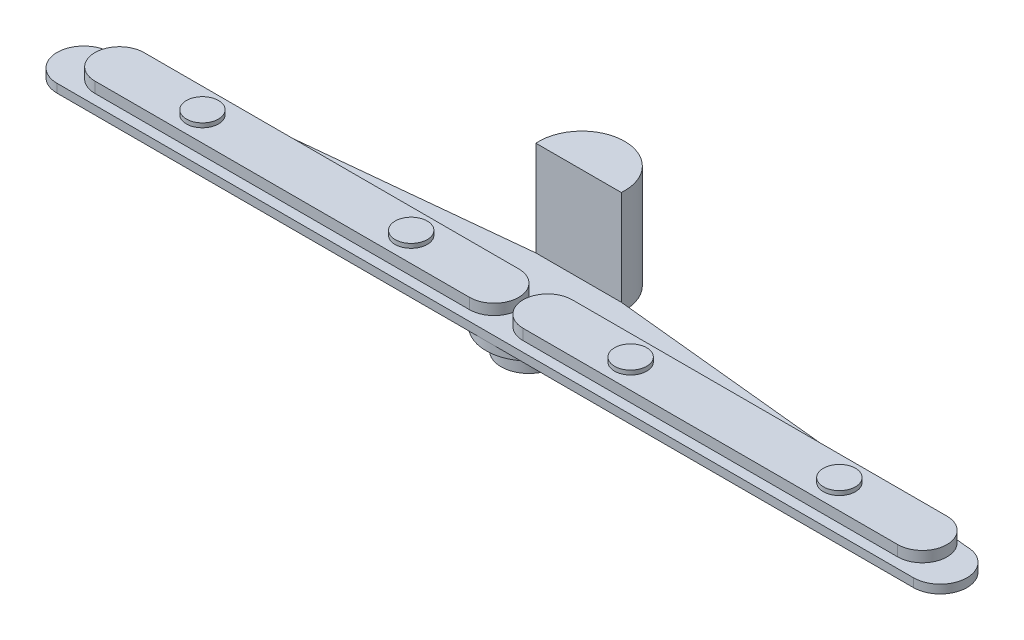
ISO-10303-21;
HEADER;
FILE_DESCRIPTION(('STEP AP214'),'2;1');
FILE_NAME('part.step','',(''),(''),'','','');
FILE_SCHEMA(('AUTOMOTIVE_DESIGN { 1 0 10303 214 1 1 1 1 }'));
ENDSEC;
DATA;
#1=APPLICATION_CONTEXT('core data for automotive mechanical design processes');
#2=APPLICATION_PROTOCOL_DEFINITION('international standard','automotive_design',2000,#1);
#3=PRODUCT_CONTEXT('',#1,'mechanical');
#4=PRODUCT('Part','Part','',(#3));
#5=PRODUCT_RELATED_PRODUCT_CATEGORY('part','',(#4));
#6=PRODUCT_DEFINITION_FORMATION('','',#4);
#7=PRODUCT_DEFINITION_CONTEXT('part definition',#1,'design');
#8=PRODUCT_DEFINITION('design','',#6,#7);
#9=PRODUCT_DEFINITION_SHAPE('','',#8);
#10=(LENGTH_UNIT() NAMED_UNIT(*) SI_UNIT(.MILLI.,.METRE.));
#11=(NAMED_UNIT(*) PLANE_ANGLE_UNIT() SI_UNIT($,.RADIAN.));
#12=(NAMED_UNIT(*) SI_UNIT($,.STERADIAN.) SOLID_ANGLE_UNIT());
#13=UNCERTAINTY_MEASURE_WITH_UNIT(LENGTH_MEASURE(1.E-05),#10,'distance_accuracy_value','');
#14=(GEOMETRIC_REPRESENTATION_CONTEXT(3) GLOBAL_UNCERTAINTY_ASSIGNED_CONTEXT((#13)) GLOBAL_UNIT_ASSIGNED_CONTEXT((#10,
#11,#12)) REPRESENTATION_CONTEXT('',''));
#15=CARTESIAN_POINT('',(0.,0.,0.));
#16=DIRECTION('',(0.,0.,1.));
#17=DIRECTION('',(1.,0.,0.));
#18=AXIS2_PLACEMENT_3D('',#15,#16,#17);
#19=CARTESIAN_POINT('',(-1446.89535492094,40.,407.233116230003));
#20=DIRECTION('',(0.,1.,0.));
#21=DIRECTION('',(0.,0.,1.));
#22=AXIS2_PLACEMENT_3D('',#19,#20,#21);
#23=PLANE('',#22);
#24=DIRECTION('',(-0.994906857184754,0.,-0.100798539308642));
#25=VECTOR('',#24,1.);
#26=CARTESIAN_POINT('',(2553.06053303877,40.,282.233124013492));
#27=LINE('',#26,#25);
#28=CARTESIAN_POINT('',(2281.62856086851,40.,254.733116230003));
#29=VERTEX_POINT('',#28);
#30=CARTESIAN_POINT('',(756.636813568834,40.,100.229265467022));
#31=VERTEX_POINT('',#30);
#32=EDGE_CURVE('E284',#29,#31,#27,.T.);
#33=ORIENTED_EDGE('',*,*,#32,.T.);
#34=DIRECTION('',(1.,0.,0.));
#35=VECTOR('',#34,1.);
#36=CARTESIAN_POINT('',(756.636813568834,40.,100.229265467022));
#37=LINE('',#36,#35);
#38=CARTESIAN_POINT('',(357.756813568834,40.,100.229265467022));
#39=VERTEX_POINT('',#38);
#40=EDGE_CURVE('E171',#39,#31,#37,.T.);
#41=ORIENTED_EDGE('',*,*,#40,.F.);
#42=DIRECTION('',(-0.994891530483461,0.,0.100949703180724));
#43=VECTOR('',#42,1.);
#44=CARTESIAN_POINT('',(-1438.63923170271,40.,282.5060685242));
#45=LINE('',#44,#43);
#46=CARTESIAN_POINT('',(-1164.92792653372,40.,254.733116230003));
#47=VERTEX_POINT('',#46);
#48=EDGE_CURVE('E290',#39,#47,#45,.T.);
#49=ORIENTED_EDGE('',*,*,#48,.T.);
#50=DIRECTION('',(-1.,0.,0.));
#51=VECTOR('',#50,1.);
#52=CARTESIAN_POINT('',(-1317.80318643117,40.,254.733116230003));
#53=LINE('',#52,#51);
#54=CARTESIAN_POINT('',(432.196813568834,40.,254.733116230003));
#55=VERTEX_POINT('',#54);
#56=EDGE_CURVE('E227',#55,#47,#53,.T.);
#57=ORIENTED_EDGE('',*,*,#56,.F.);
#58=CARTESIAN_POINT('',(432.196813568834,40.,369.733116230003));
#59=DIRECTION('',(0.,1.,0.));
#60=DIRECTION('',(0.,0.,1.));
#61=AXIS2_PLACEMENT_3D('',#58,#59,#60);
#62=CIRCLE('',#61,115.);
#63=CARTESIAN_POINT('',(432.196813568834,40.,484.733116230003));
#64=VERTEX_POINT('',#63);
#65=EDGE_CURVE('E210',#64,#55,#62,.T.);
#66=ORIENTED_EDGE('',*,*,#65,.F.);
#67=DIRECTION('',(1.,0.,0.));
#68=VECTOR('',#67,1.);
#69=CARTESIAN_POINT('',(432.196813568834,40.,484.733116230003));
#70=LINE('',#69,#68);
#71=CARTESIAN_POINT('',(-1317.80318643117,40.,484.733116230003));
#72=VERTEX_POINT('',#71);
#73=EDGE_CURVE('E217',#72,#64,#70,.T.);
#74=ORIENTED_EDGE('',*,*,#73,.F.);
#75=CARTESIAN_POINT('',(-1317.80318643117,40.,369.733116230003));
#76=DIRECTION('',(0.,1.,0.));
#77=DIRECTION('',(0.,0.,1.));
#78=AXIS2_PLACEMENT_3D('',#75,#76,#77);
#79=CIRCLE('',#78,115.);
#80=CARTESIAN_POINT('',(-1386.04516728354,40.,277.169451386045));
#81=VERTEX_POINT('',#80);
#82=EDGE_CURVE('E37',#72,#81,#79,.F.);
#83=ORIENTED_EDGE('',*,*,#82,.T.);
#84=CARTESIAN_POINT('',(-1438.63923170271,40.,282.5060685242));
#85=VERTEX_POINT('',#84);
#86=EDGE_CURVE('E288',#81,#85,#45,.T.);
#87=ORIENTED_EDGE('',*,*,#86,.T.);
#88=CARTESIAN_POINT('',(-1446.89535492094,40.,407.233116230003));
#89=DIRECTION('',(0.,1.,0.));
#90=DIRECTION('',(0.,0.,1.));
#91=AXIS2_PLACEMENT_3D('',#88,#89,#90);
#92=CIRCLE('',#91,125.);
#93=CARTESIAN_POINT('',(-1446.89535492094,40.,532.233116230003));
#94=VERTEX_POINT('',#93);
#95=EDGE_CURVE('E276',#85,#94,#92,.T.);
#96=ORIENTED_EDGE('',*,*,#95,.T.);
#97=DIRECTION('',(1.,0.,0.));
#98=VECTOR('',#97,1.);
#99=CARTESIAN_POINT('',(-1446.89535492094,40.,532.233116230003));
#100=LINE('',#99,#98);
#101=CARTESIAN_POINT('',(2553.10464507906,40.,532.233116230002));
#102=VERTEX_POINT('',#101);
#103=EDGE_CURVE('E279',#94,#102,#100,.T.);
#104=ORIENTED_EDGE('',*,*,#103,.T.);
#105=CARTESIAN_POINT('',(2553.10464507906,40.,407.233116230003));
#106=DIRECTION('',(0.,1.,0.));
#107=DIRECTION('',(0.,0.,1.));
#108=AXIS2_PLACEMENT_3D('',#105,#106,#107);
#109=CIRCLE('',#108,125.);
#110=CARTESIAN_POINT('',(2553.06053303877,40.,282.233124013492));
#111=VERTEX_POINT('',#110);
#112=EDGE_CURVE('E282',#102,#111,#109,.T.);
#113=ORIENTED_EDGE('',*,*,#112,.T.);
#114=CARTESIAN_POINT('',(2500.01553383146,40.,276.858893854043));
#115=VERTEX_POINT('',#114);
#116=EDGE_CURVE('E285',#111,#115,#27,.T.);
#117=ORIENTED_EDGE('',*,*,#116,.T.);
#118=CARTESIAN_POINT('',(2432.19681356883,40.,369.733116230003));
#119=DIRECTION('',(0.,1.,0.));
#120=DIRECTION('',(0.,0.,1.));
#121=AXIS2_PLACEMENT_3D('',#118,#119,#120);
#122=CIRCLE('',#121,115.);
#123=CARTESIAN_POINT('',(2432.19681356883,40.,484.733116230003));
#124=VERTEX_POINT('',#123);
#125=EDGE_CURVE('E258',#124,#115,#122,.T.);
#126=ORIENTED_EDGE('',*,*,#125,.F.);
#127=DIRECTION('',(1.,0.,0.));
#128=VECTOR('',#127,1.);
#129=CARTESIAN_POINT('',(682.196813568834,40.,484.733116230003));
#130=LINE('',#129,#128);
#131=CARTESIAN_POINT('',(682.196813568834,40.,484.733116230003));
#132=VERTEX_POINT('',#131);
#133=EDGE_CURVE('E254',#132,#124,#130,.T.);
#134=ORIENTED_EDGE('',*,*,#133,.F.);
#135=CARTESIAN_POINT('',(682.196813568834,40.,369.733116230003));
#136=DIRECTION('',(0.,1.,0.));
#137=DIRECTION('',(0.,0.,1.));
#138=AXIS2_PLACEMENT_3D('',#135,#136,#137);
#139=CIRCLE('',#138,115.);
#140=CARTESIAN_POINT('',(682.196813568834,40.,254.733116230003));
#141=VERTEX_POINT('',#140);
#142=EDGE_CURVE('E57',#141,#132,#139,.T.);
#143=ORIENTED_EDGE('',*,*,#142,.F.);
#144=DIRECTION('',(-1.,0.,0.));
#145=VECTOR('',#144,1.);
#146=CARTESIAN_POINT('',(682.196813568834,40.,254.733116230003));
#147=LINE('',#146,#145);
#148=EDGE_CURVE('E263',#29,#141,#147,.T.);
#149=ORIENTED_EDGE('',*,*,#148,.F.);
#150=EDGE_LOOP('',(#33,#41,#49,#57,#66,#74,#83,#87,#96,#104,#113,#117,#126,#134,#143,#149));
#151=FACE_BOUND('',#150,.T.);
#152=ADVANCED_FACE('F33',(#151),#23,.T.);
#153=CARTESIAN_POINT('',(-1446.89535492094,40.,407.233116230003));
#154=DIRECTION('',(0.,-1.,0.));
#155=DIRECTION('',(0.,0.,-1.));
#156=AXIS2_PLACEMENT_3D('',#153,#154,#155);
#157=CYLINDRICAL_SURFACE('',#156,125.);
#158=CARTESIAN_POINT('',(-1446.89535492094,0.,407.233116230003));
#159=DIRECTION('',(0.,1.,0.));
#160=DIRECTION('',(0.,0.,1.));
#161=AXIS2_PLACEMENT_3D('',#158,#159,#160);
#162=CIRCLE('',#161,125.);
#163=CARTESIAN_POINT('',(-1438.63923170271,0.,282.5060685242));
#164=VERTEX_POINT('',#163);
#165=CARTESIAN_POINT('',(-1446.89535492094,0.,532.233116230003));
#166=VERTEX_POINT('',#165);
#167=EDGE_CURVE('E275',#164,#166,#162,.T.);
#168=ORIENTED_EDGE('',*,*,#167,.T.);
#169=DIRECTION('',(0.,-1.,0.));
#170=VECTOR('',#169,1.);
#171=CARTESIAN_POINT('',(-1446.89535492094,40.,532.233116230003));
#172=LINE('',#171,#170);
#173=EDGE_CURVE('E318',#94,#166,#172,.T.);
#174=ORIENTED_EDGE('',*,*,#173,.F.);
#175=ORIENTED_EDGE('',*,*,#95,.F.);
#176=DIRECTION('',(0.,-1.,0.));
#177=VECTOR('',#176,1.);
#178=CARTESIAN_POINT('',(-1438.63923170271,40.,282.5060685242));
#179=LINE('',#178,#177);
#180=EDGE_CURVE('E293',#85,#164,#179,.T.);
#181=ORIENTED_EDGE('',*,*,#180,.T.);
#182=EDGE_LOOP('',(#168,#174,#175,#181));
#183=FACE_BOUND('',#182,.T.);
#184=ADVANCED_FACE('F35',(#183),#157,.T.);
#185=CARTESIAN_POINT('',(-1446.89535492094,40.,532.233116230003));
#186=DIRECTION('',(0.,0.,-1.));
#187=DIRECTION('',(-1.,0.,0.));
#188=AXIS2_PLACEMENT_3D('',#185,#186,#187);
#189=PLANE('',#188);
#190=DIRECTION('',(1.,0.,0.));
#191=VECTOR('',#190,1.);
#192=CARTESIAN_POINT('',(-1446.89535492094,0.,532.233116230003));
#193=LINE('',#192,#191);
#194=CARTESIAN_POINT('',(557.196813568834,0.,532.233116230002));
#195=VERTEX_POINT('',#194);
#196=EDGE_CURVE('E298',#166,#195,#193,.T.);
#197=ORIENTED_EDGE('',*,*,#196,.T.);
#198=CARTESIAN_POINT('',(2553.10464507906,0.,532.233116230002));
#199=VERTEX_POINT('',#198);
#200=EDGE_CURVE('E297',#195,#199,#193,.T.);
#201=ORIENTED_EDGE('',*,*,#200,.T.);
#202=DIRECTION('',(0.,-1.,0.));
#203=VECTOR('',#202,1.);
#204=CARTESIAN_POINT('',(2553.10464507906,40.,532.233116230002));
#205=LINE('',#204,#203);
#206=EDGE_CURVE('E316',#102,#199,#205,.T.);
#207=ORIENTED_EDGE('',*,*,#206,.F.);
#208=ORIENTED_EDGE('',*,*,#103,.F.);
#209=ORIENTED_EDGE('',*,*,#173,.T.);
#210=EDGE_LOOP('',(#197,#201,#207,#208,#209));
#211=FACE_BOUND('',#210,.T.);
#212=ADVANCED_FACE('F356',(#211),#189,.F.);
#213=CARTESIAN_POINT('',(2553.10464507906,40.,407.233116230003));
#214=DIRECTION('',(0.,-1.,0.));
#215=DIRECTION('',(0.,0.,-1.));
#216=AXIS2_PLACEMENT_3D('',#213,#214,#215);
#217=CYLINDRICAL_SURFACE('',#216,125.);
#218=CARTESIAN_POINT('',(2553.10464507906,0.,407.233116230003));
#219=DIRECTION('',(0.,1.,0.));
#220=DIRECTION('',(0.,0.,1.));
#221=AXIS2_PLACEMENT_3D('',#218,#219,#220);
#222=CIRCLE('',#221,125.);
#223=CARTESIAN_POINT('',(2553.06053303877,0.,282.233124013492));
#224=VERTEX_POINT('',#223);
#225=EDGE_CURVE('E300',#199,#224,#222,.T.);
#226=ORIENTED_EDGE('',*,*,#225,.T.);
#227=DIRECTION('',(0.,-1.,0.));
#228=VECTOR('',#227,1.);
#229=CARTESIAN_POINT('',(2553.06053303877,40.,282.233124013492));
#230=LINE('',#229,#228);
#231=EDGE_CURVE('E313',#111,#224,#230,.T.);
#232=ORIENTED_EDGE('',*,*,#231,.F.);
#233=ORIENTED_EDGE('',*,*,#112,.F.);
#234=ORIENTED_EDGE('',*,*,#206,.T.);
#235=EDGE_LOOP('',(#226,#232,#233,#234));
#236=FACE_BOUND('',#235,.T.);
#237=ADVANCED_FACE('F359',(#236),#217,.T.);
#238=CARTESIAN_POINT('',(2553.06053303877,40.,282.233124013492));
#239=DIRECTION('',(-0.100798539308642,0.,0.994906857184754));
#240=DIRECTION('',(0.994906857184754,0.,0.100798539308642));
#241=AXIS2_PLACEMENT_3D('',#238,#239,#240);
#242=PLANE('',#241);
#243=DIRECTION('',(-0.994906857184754,0.,-0.100798539308642));
#244=VECTOR('',#243,1.);
#245=CARTESIAN_POINT('',(2553.06053303877,0.,282.233124013492));
#246=LINE('',#245,#244);
#247=CARTESIAN_POINT('',(756.636813568834,0.,100.229265467022));
#248=VERTEX_POINT('',#247);
#249=EDGE_CURVE('E302',#224,#248,#246,.T.);
#250=ORIENTED_EDGE('',*,*,#249,.T.);
#251=DIRECTION('',(0.,-1.,0.));
#252=VECTOR('',#251,1.);
#253=CARTESIAN_POINT('',(756.636813568834,40.,100.229265467022));
#254=LINE('',#253,#252);
#255=EDGE_CURVE('E310',#31,#248,#254,.T.);
#256=ORIENTED_EDGE('',*,*,#255,.F.);
#257=ORIENTED_EDGE('',*,*,#32,.F.);
#258=EDGE_CURVE('E289',#115,#29,#27,.T.);
#259=ORIENTED_EDGE('',*,*,#258,.F.);
#260=ORIENTED_EDGE('',*,*,#116,.F.);
#261=ORIENTED_EDGE('',*,*,#231,.T.);
#262=EDGE_LOOP('',(#250,#256,#257,#259,#260,#261));
#263=FACE_BOUND('',#262,.T.);
#264=ADVANCED_FACE('F362',(#263),#242,.F.);
#265=CARTESIAN_POINT('',(557.196813568834,40.,85.2731162300026));
#266=DIRECTION('',(0.,-1.,0.));
#267=DIRECTION('',(0.,0.,-1.));
#268=AXIS2_PLACEMENT_3D('',#265,#266,#267);
#269=CYLINDRICAL_SURFACE('',#268,200.);
#270=CARTESIAN_POINT('',(557.196813568834,0.,85.2731162300026));
#271=DIRECTION('',(0.,1.,0.));
#272=DIRECTION('',(0.,0.,1.));
#273=AXIS2_PLACEMENT_3D('',#270,#271,#272);
#274=CIRCLE('',#273,200.);
#275=CARTESIAN_POINT('',(357.756813568834,0.,100.229265467022));
#276=VERTEX_POINT('',#275);
#277=EDGE_CURVE('E304',#248,#276,#274,.T.);
#278=ORIENTED_EDGE('',*,*,#277,.T.);
#279=DIRECTION('',(0.,-1.,0.));
#280=VECTOR('',#279,1.);
#281=CARTESIAN_POINT('',(357.756813568834,40.,100.229265467022));
#282=LINE('',#281,#280);
#283=EDGE_CURVE('E176',#39,#276,#282,.T.);
#284=ORIENTED_EDGE('',*,*,#283,.F.);
#285=DIRECTION('',(0.,-1.,0.));
#286=VECTOR('',#285,1.);
#287=CARTESIAN_POINT('',(357.756813568834,484.,100.229265467022));
#288=LINE('',#287,#286);
#289=CARTESIAN_POINT('',(357.756813568834,484.,100.229265467022));
#290=VERTEX_POINT('',#289);
#291=EDGE_CURVE('E162',#290,#39,#288,.T.);
#292=ORIENTED_EDGE('',*,*,#291,.F.);
#293=CARTESIAN_POINT('',(557.196813568834,484.,85.2731162300026));
#294=DIRECTION('',(0.,1.,0.));
#295=DIRECTION('',(0.,0.,1.));
#296=AXIS2_PLACEMENT_3D('',#293,#294,#295);
#297=CIRCLE('',#296,200.);
#298=CARTESIAN_POINT('',(756.636813568834,484.,100.229265467022));
#299=VERTEX_POINT('',#298);
#300=EDGE_CURVE('E167',#299,#290,#297,.T.);
#301=ORIENTED_EDGE('',*,*,#300,.F.);
#302=DIRECTION('',(0.,-1.,0.));
#303=VECTOR('',#302,1.);
#304=CARTESIAN_POINT('',(756.636813568834,484.,100.229265467022));
#305=LINE('',#304,#303);
#306=EDGE_CURVE('E164',#299,#31,#305,.T.);
#307=ORIENTED_EDGE('',*,*,#306,.T.);
#308=ORIENTED_EDGE('',*,*,#255,.T.);
#309=EDGE_LOOP('',(#278,#284,#292,#301,#307,#308));
#310=FACE_BOUND('',#309,.T.);
#311=ADVANCED_FACE('F174',(#310),#269,.T.);
#312=CARTESIAN_POINT('',(-1438.63923170271,40.,282.5060685242));
#313=DIRECTION('',(0.100949703180724,0.,0.994891530483461));
#314=DIRECTION('',(0.994891530483461,0.,-0.100949703180724));
#315=AXIS2_PLACEMENT_3D('',#312,#313,#314);
#316=PLANE('',#315);
#317=DIRECTION('',(-0.994891530483461,0.,0.100949703180724));
#318=VECTOR('',#317,1.);
#319=CARTESIAN_POINT('',(-1438.63923170271,0.,282.5060685242));
#320=LINE('',#319,#318);
#321=EDGE_CURVE('E280',#276,#164,#320,.T.);
#322=ORIENTED_EDGE('',*,*,#321,.T.);
#323=ORIENTED_EDGE('',*,*,#180,.F.);
#324=ORIENTED_EDGE('',*,*,#86,.F.);
#325=EDGE_CURVE('E294',#47,#81,#45,.T.);
#326=ORIENTED_EDGE('',*,*,#325,.F.);
#327=ORIENTED_EDGE('',*,*,#48,.F.);
#328=ORIENTED_EDGE('',*,*,#283,.T.);
#329=EDGE_LOOP('',(#322,#323,#324,#326,#327,#328));
#330=FACE_BOUND('',#329,.T.);
#331=ADVANCED_FACE('F332',(#330),#316,.F.);
#332=CARTESIAN_POINT('',(-1446.89535492094,0.,407.233116230003));
#333=DIRECTION('',(0.,1.,0.));
#334=DIRECTION('',(0.,0.,1.));
#335=AXIS2_PLACEMENT_3D('',#332,#333,#334);
#336=PLANE('',#335);
#337=ORIENTED_EDGE('',*,*,#200,.F.);
#338=CARTESIAN_POINT('',(557.196813568834,0.,332.233116230002));
#339=DIRECTION('',(0.,-1.,0.));
#340=DIRECTION('',(0.,0.,-1.));
#341=AXIS2_PLACEMENT_3D('',#338,#339,#340);
#342=CIRCLE('',#341,200.);
#343=EDGE_CURVE('E178',#195,#195,#342,.T.);
#344=ORIENTED_EDGE('',*,*,#343,.F.);
#345=ORIENTED_EDGE('',*,*,#196,.F.);
#346=ORIENTED_EDGE('',*,*,#167,.F.);
#347=ORIENTED_EDGE('',*,*,#321,.F.);
#348=ORIENTED_EDGE('',*,*,#277,.F.);
#349=ORIENTED_EDGE('',*,*,#249,.F.);
#350=ORIENTED_EDGE('',*,*,#225,.F.);
#351=EDGE_LOOP('',(#337,#344,#345,#346,#347,#348,#349,#350));
#352=FACE_BOUND('',#351,.T.);
#353=ADVANCED_FACE('F349',(#352),#336,.F.);
#354=CARTESIAN_POINT('',(682.196813568834,40.,369.733116230003));
#355=DIRECTION('',(0.,1.,0.));
#356=DIRECTION('',(0.,0.,1.));
#357=AXIS2_PLACEMENT_3D('',#354,#355,#356);
#358=PLANE('',#357);
#359=CARTESIAN_POINT('',(2432.19681356883,40.,254.733116230002));
#360=VERTEX_POINT('',#359);
#361=EDGE_CURVE('E257',#115,#360,#122,.T.);
#362=ORIENTED_EDGE('',*,*,#361,.F.);
#363=ORIENTED_EDGE('',*,*,#258,.T.);
#364=EDGE_CURVE('E246',#360,#29,#147,.T.);
#365=ORIENTED_EDGE('',*,*,#364,.F.);
#366=EDGE_LOOP('',(#362,#363,#365));
#367=FACE_BOUND('',#366,.T.);
#368=ADVANCED_FACE('F368',(#367),#358,.F.);
#369=CARTESIAN_POINT('',(682.196813568834,90.,369.733116230003));
#370=DIRECTION('',(0.,-1.,0.));
#371=DIRECTION('',(0.,0.,-1.));
#372=AXIS2_PLACEMENT_3D('',#369,#370,#371);
#373=CYLINDRICAL_SURFACE('',#372,115.);
#374=ORIENTED_EDGE('',*,*,#142,.T.);
#375=DIRECTION('',(0.,-1.,0.));
#376=VECTOR('',#375,1.);
#377=CARTESIAN_POINT('',(682.196813568834,90.,484.733116230003));
#378=LINE('',#377,#376);
#379=CARTESIAN_POINT('',(682.196813568834,90.,484.733116230003));
#380=VERTEX_POINT('',#379);
#381=EDGE_CURVE('E272',#380,#132,#378,.T.);
#382=ORIENTED_EDGE('',*,*,#381,.F.);
#383=CARTESIAN_POINT('',(682.196813568834,90.,369.733116230003));
#384=DIRECTION('',(0.,1.,0.));
#385=DIRECTION('',(0.,0.,1.));
#386=AXIS2_PLACEMENT_3D('',#383,#384,#385);
#387=CIRCLE('',#386,115.);
#388=CARTESIAN_POINT('',(682.196813568834,90.,254.733116230003));
#389=VERTEX_POINT('',#388);
#390=EDGE_CURVE('E242',#389,#380,#387,.T.);
#391=ORIENTED_EDGE('',*,*,#390,.F.);
#392=DIRECTION('',(0.,-1.,0.));
#393=VECTOR('',#392,1.);
#394=CARTESIAN_POINT('',(682.196813568834,90.,254.733116230003));
#395=LINE('',#394,#393);
#396=EDGE_CURVE('E252',#389,#141,#395,.T.);
#397=ORIENTED_EDGE('',*,*,#396,.T.);
#398=EDGE_LOOP('',(#374,#382,#391,#397));
#399=FACE_BOUND('',#398,.T.);
#400=ADVANCED_FACE('F379',(#399),#373,.T.);
#401=CARTESIAN_POINT('',(682.196813568834,90.,484.733116230003));
#402=DIRECTION('',(0.,0.,-1.));
#403=DIRECTION('',(-1.,0.,0.));
#404=AXIS2_PLACEMENT_3D('',#401,#402,#403);
#405=PLANE('',#404);
#406=ORIENTED_EDGE('',*,*,#133,.T.);
#407=DIRECTION('',(0.,-1.,0.));
#408=VECTOR('',#407,1.);
#409=CARTESIAN_POINT('',(2432.19681356883,90.,484.733116230003));
#410=LINE('',#409,#408);
#411=CARTESIAN_POINT('',(2432.19681356883,90.,484.733116230003));
#412=VERTEX_POINT('',#411);
#413=EDGE_CURVE('E269',#412,#124,#410,.T.);
#414=ORIENTED_EDGE('',*,*,#413,.F.);
#415=DIRECTION('',(1.,0.,0.));
#416=VECTOR('',#415,1.);
#417=CARTESIAN_POINT('',(682.196813568834,90.,484.733116230003));
#418=LINE('',#417,#416);
#419=EDGE_CURVE('E245',#380,#412,#418,.T.);
#420=ORIENTED_EDGE('',*,*,#419,.F.);
#421=ORIENTED_EDGE('',*,*,#381,.T.);
#422=EDGE_LOOP('',(#406,#414,#420,#421));
#423=FACE_BOUND('',#422,.T.);
#424=ADVANCED_FACE('F375',(#423),#405,.F.);
#425=CARTESIAN_POINT('',(2432.19681356883,90.,369.733116230003));
#426=DIRECTION('',(0.,-1.,0.));
#427=DIRECTION('',(0.,0.,-1.));
#428=AXIS2_PLACEMENT_3D('',#425,#426,#427);
#429=CYLINDRICAL_SURFACE('',#428,115.);
#430=ORIENTED_EDGE('',*,*,#125,.T.);
#431=ORIENTED_EDGE('',*,*,#361,.T.);
#432=DIRECTION('',(0.,-1.,0.));
#433=VECTOR('',#432,1.);
#434=CARTESIAN_POINT('',(2432.19681356883,90.,254.733116230002));
#435=LINE('',#434,#433);
#436=CARTESIAN_POINT('',(2432.19681356883,90.,254.733116230002));
#437=VERTEX_POINT('',#436);
#438=EDGE_CURVE('E266',#437,#360,#435,.T.);
#439=ORIENTED_EDGE('',*,*,#438,.F.);
#440=CARTESIAN_POINT('',(2432.19681356883,90.,369.733116230003));
#441=DIRECTION('',(0.,1.,0.));
#442=DIRECTION('',(0.,0.,1.));
#443=AXIS2_PLACEMENT_3D('',#440,#441,#442);
#444=CIRCLE('',#443,115.);
#445=EDGE_CURVE('E248',#412,#437,#444,.T.);
#446=ORIENTED_EDGE('',*,*,#445,.F.);
#447=ORIENTED_EDGE('',*,*,#413,.T.);
#448=EDGE_LOOP('',(#430,#431,#439,#446,#447));
#449=FACE_BOUND('',#448,.T.);
#450=ADVANCED_FACE('F371',(#449),#429,.T.);
#451=CARTESIAN_POINT('',(682.196813568834,90.,254.733116230003));
#452=DIRECTION('',(0.,0.,1.));
#453=DIRECTION('',(1.,0.,0.));
#454=AXIS2_PLACEMENT_3D('',#451,#452,#453);
#455=PLANE('',#454);
#456=ORIENTED_EDGE('',*,*,#364,.T.);
#457=ORIENTED_EDGE('',*,*,#148,.T.);
#458=ORIENTED_EDGE('',*,*,#396,.F.);
#459=DIRECTION('',(-1.,0.,0.));
#460=VECTOR('',#459,1.);
#461=CARTESIAN_POINT('',(682.196813568834,90.,254.733116230003));
#462=LINE('',#461,#460);
#463=EDGE_CURVE('E250',#437,#389,#462,.T.);
#464=ORIENTED_EDGE('',*,*,#463,.F.);
#465=ORIENTED_EDGE('',*,*,#438,.T.);
#466=EDGE_LOOP('',(#456,#457,#458,#464,#465));
#467=FACE_BOUND('',#466,.T.);
#468=ADVANCED_FACE('F381',(#467),#455,.F.);
#469=CARTESIAN_POINT('',(682.196813568834,90.,369.733116230003));
#470=DIRECTION('',(0.,1.,0.));
#471=DIRECTION('',(0.,0.,1.));
#472=AXIS2_PLACEMENT_3D('',#469,#470,#471);
#473=PLANE('',#472);
#474=CARTESIAN_POINT('',(2044.69681356883,90.,369.733116230002));
#475=DIRECTION('',(0.,1.,0.));
#476=DIRECTION('',(0.,0.,1.));
#477=AXIS2_PLACEMENT_3D('',#474,#475,#476);
#478=CIRCLE('',#477,75.);
#479=CARTESIAN_POINT('',(2044.69681356883,90.,444.733116230002));
#480=VERTEX_POINT('',#479);
#481=EDGE_CURVE('E187',#480,#480,#478,.T.);
#482=ORIENTED_EDGE('',*,*,#481,.F.);
#483=EDGE_LOOP('',(#482));
#484=FACE_BOUND('',#483,.T.);
#485=CARTESIAN_POINT('',(1069.69681356883,90.,369.733116230002));
#486=DIRECTION('',(0.,1.,0.));
#487=DIRECTION('',(0.,0.,1.));
#488=AXIS2_PLACEMENT_3D('',#485,#486,#487);
#489=CIRCLE('',#488,75.0000000000002);
#490=CARTESIAN_POINT('',(1069.69681356883,90.,444.733116230003));
#491=VERTEX_POINT('',#490);
#492=EDGE_CURVE('E192',#491,#491,#489,.T.);
#493=ORIENTED_EDGE('',*,*,#492,.F.);
#494=EDGE_LOOP('',(#493));
#495=FACE_BOUND('',#494,.T.);
#496=ORIENTED_EDGE('',*,*,#390,.T.);
#497=ORIENTED_EDGE('',*,*,#419,.T.);
#498=ORIENTED_EDGE('',*,*,#445,.T.);
#499=ORIENTED_EDGE('',*,*,#463,.T.);
#500=EDGE_LOOP('',(#496,#497,#498,#499));
#501=FACE_BOUND('',#500,.T.);
#502=ADVANCED_FACE('F383',(#484,#495,#501),#473,.T.);
#503=CARTESIAN_POINT('',(432.196813568834,40.,369.733116230003));
#504=DIRECTION('',(0.,1.,0.));
#505=DIRECTION('',(0.,0.,1.));
#506=AXIS2_PLACEMENT_3D('',#503,#504,#505);
#507=PLANE('',#506);
#508=CARTESIAN_POINT('',(-1317.80318643117,40.,254.733116230003));
#509=VERTEX_POINT('',#508);
#510=EDGE_CURVE('E226',#47,#509,#53,.T.);
#511=ORIENTED_EDGE('',*,*,#510,.F.);
#512=ORIENTED_EDGE('',*,*,#325,.T.);
#513=CARTESIAN_POINT('',(-1317.80318643117,40.,369.733116230003));
#514=DIRECTION('',(0.,1.,0.));
#515=DIRECTION('',(0.,0.,1.));
#516=AXIS2_PLACEMENT_3D('',#513,#514,#515);
#517=CIRCLE('',#516,115.);
#518=EDGE_CURVE('E230',#509,#81,#517,.T.);
#519=ORIENTED_EDGE('',*,*,#518,.F.);
#520=EDGE_LOOP('',(#511,#512,#519));
#521=FACE_BOUND('',#520,.T.);
#522=ADVANCED_FACE('F336',(#521),#507,.F.);
#523=CARTESIAN_POINT('',(432.196813568834,90.,369.733116230003));
#524=DIRECTION('',(0.,-1.,0.));
#525=DIRECTION('',(0.,0.,-1.));
#526=AXIS2_PLACEMENT_3D('',#523,#524,#525);
#527=CYLINDRICAL_SURFACE('',#526,115.);
#528=ORIENTED_EDGE('',*,*,#65,.T.);
#529=DIRECTION('',(0.,-1.,0.));
#530=VECTOR('',#529,1.);
#531=CARTESIAN_POINT('',(432.196813568834,90.,254.733116230003));
#532=LINE('',#531,#530);
#533=CARTESIAN_POINT('',(432.196813568834,90.,254.733116230003));
#534=VERTEX_POINT('',#533);
#535=EDGE_CURVE('E240',#534,#55,#532,.T.);
#536=ORIENTED_EDGE('',*,*,#535,.F.);
#537=CARTESIAN_POINT('',(432.196813568834,90.,369.733116230003));
#538=DIRECTION('',(0.,1.,0.));
#539=DIRECTION('',(0.,0.,1.));
#540=AXIS2_PLACEMENT_3D('',#537,#538,#539);
#541=CIRCLE('',#540,115.);
#542=CARTESIAN_POINT('',(432.196813568834,90.,484.733116230003));
#543=VERTEX_POINT('',#542);
#544=EDGE_CURVE('E213',#543,#534,#541,.T.);
#545=ORIENTED_EDGE('',*,*,#544,.F.);
#546=DIRECTION('',(0.,-1.,0.));
#547=VECTOR('',#546,1.);
#548=CARTESIAN_POINT('',(432.196813568834,90.,484.733116230003));
#549=LINE('',#548,#547);
#550=EDGE_CURVE('E223',#543,#64,#549,.T.);
#551=ORIENTED_EDGE('',*,*,#550,.T.);
#552=EDGE_LOOP('',(#528,#536,#545,#551));
#553=FACE_BOUND('',#552,.T.);
#554=ADVANCED_FACE('F391',(#553),#527,.T.);
#555=CARTESIAN_POINT('',(-1317.80318643117,90.,254.733116230003));
#556=DIRECTION('',(0.,0.,1.));
#557=DIRECTION('',(1.,0.,0.));
#558=AXIS2_PLACEMENT_3D('',#555,#556,#557);
#559=PLANE('',#558);
#560=ORIENTED_EDGE('',*,*,#56,.T.);
#561=ORIENTED_EDGE('',*,*,#510,.T.);
#562=DIRECTION('',(0.,-1.,0.));
#563=VECTOR('',#562,1.);
#564=CARTESIAN_POINT('',(-1317.80318643117,90.,254.733116230003));
#565=LINE('',#564,#563);
#566=CARTESIAN_POINT('',(-1317.80318643117,90.,254.733116230003));
#567=VERTEX_POINT('',#566);
#568=EDGE_CURVE('E237',#567,#509,#565,.T.);
#569=ORIENTED_EDGE('',*,*,#568,.F.);
#570=DIRECTION('',(-1.,0.,0.));
#571=VECTOR('',#570,1.);
#572=CARTESIAN_POINT('',(-1317.80318643117,90.,254.733116230003));
#573=LINE('',#572,#571);
#574=EDGE_CURVE('E216',#534,#567,#573,.T.);
#575=ORIENTED_EDGE('',*,*,#574,.F.);
#576=ORIENTED_EDGE('',*,*,#535,.T.);
#577=EDGE_LOOP('',(#560,#561,#569,#575,#576));
#578=FACE_BOUND('',#577,.T.);
#579=ADVANCED_FACE('F341',(#578),#559,.F.);
#580=CARTESIAN_POINT('',(-1317.80318643117,90.,369.733116230003));
#581=DIRECTION('',(0.,-1.,0.));
#582=DIRECTION('',(0.,0.,-1.));
#583=AXIS2_PLACEMENT_3D('',#580,#581,#582);
#584=CYLINDRICAL_SURFACE('',#583,115.);
#585=ORIENTED_EDGE('',*,*,#518,.T.);
#586=ORIENTED_EDGE('',*,*,#82,.F.);
#587=DIRECTION('',(0.,-1.,0.));
#588=VECTOR('',#587,1.);
#589=CARTESIAN_POINT('',(-1317.80318643117,90.,484.733116230003));
#590=LINE('',#589,#588);
#591=CARTESIAN_POINT('',(-1317.80318643117,90.,484.733116230003));
#592=VERTEX_POINT('',#591);
#593=EDGE_CURVE('E49',#592,#72,#590,.T.);
#594=ORIENTED_EDGE('',*,*,#593,.F.);
#595=CARTESIAN_POINT('',(-1317.80318643117,90.,369.733116230003));
#596=DIRECTION('',(0.,1.,0.));
#597=DIRECTION('',(0.,0.,1.));
#598=AXIS2_PLACEMENT_3D('',#595,#596,#597);
#599=CIRCLE('',#598,115.);
#600=EDGE_CURVE('E219',#567,#592,#599,.T.);
#601=ORIENTED_EDGE('',*,*,#600,.F.);
#602=ORIENTED_EDGE('',*,*,#568,.T.);
#603=EDGE_LOOP('',(#585,#586,#594,#601,#602));
#604=FACE_BOUND('',#603,.T.);
#605=ADVANCED_FACE('F337',(#604),#584,.T.);
#606=CARTESIAN_POINT('',(432.196813568834,90.,484.733116230003));
#607=DIRECTION('',(0.,0.,-1.));
#608=DIRECTION('',(-1.,0.,0.));
#609=AXIS2_PLACEMENT_3D('',#606,#607,#608);
#610=PLANE('',#609);
#611=ORIENTED_EDGE('',*,*,#73,.T.);
#612=ORIENTED_EDGE('',*,*,#550,.F.);
#613=DIRECTION('',(1.,0.,0.));
#614=VECTOR('',#613,1.);
#615=CARTESIAN_POINT('',(432.196813568834,90.,484.733116230003));
#616=LINE('',#615,#614);
#617=EDGE_CURVE('E221',#592,#543,#616,.T.);
#618=ORIENTED_EDGE('',*,*,#617,.F.);
#619=ORIENTED_EDGE('',*,*,#593,.T.);
#620=EDGE_LOOP('',(#611,#612,#618,#619));
#621=FACE_BOUND('',#620,.T.);
#622=ADVANCED_FACE('F500',(#621),#610,.F.);
#623=CARTESIAN_POINT('',(432.196813568834,90.,369.733116230003));
#624=DIRECTION('',(0.,1.,0.));
#625=DIRECTION('',(0.,0.,1.));
#626=AXIS2_PLACEMENT_3D('',#623,#624,#625);
#627=PLANE('',#626);
#628=CARTESIAN_POINT('',(44.6968135688339,90.,369.733116230002));
#629=DIRECTION('',(0.,1.,0.));
#630=DIRECTION('',(0.,0.,1.));
#631=AXIS2_PLACEMENT_3D('',#628,#629,#630);
#632=CIRCLE('',#631,75.);
#633=CARTESIAN_POINT('',(44.6968135688339,90.,444.733116230002));
#634=VERTEX_POINT('',#633);
#635=EDGE_CURVE('E198',#634,#634,#632,.T.);
#636=ORIENTED_EDGE('',*,*,#635,.F.);
#637=EDGE_LOOP('',(#636));
#638=FACE_BOUND('',#637,.T.);
#639=CARTESIAN_POINT('',(-930.303186431166,90.,369.733116230002));
#640=DIRECTION('',(0.,1.,0.));
#641=DIRECTION('',(0.,0.,1.));
#642=AXIS2_PLACEMENT_3D('',#639,#640,#641);
#643=CIRCLE('',#642,75.);
#644=CARTESIAN_POINT('',(-930.303186431166,90.,444.733116230002));
#645=VERTEX_POINT('',#644);
#646=EDGE_CURVE('E204',#645,#645,#643,.T.);
#647=ORIENTED_EDGE('',*,*,#646,.F.);
#648=EDGE_LOOP('',(#647));
#649=FACE_BOUND('',#648,.T.);
#650=ORIENTED_EDGE('',*,*,#544,.T.);
#651=ORIENTED_EDGE('',*,*,#574,.T.);
#652=ORIENTED_EDGE('',*,*,#600,.T.);
#653=ORIENTED_EDGE('',*,*,#617,.T.);
#654=EDGE_LOOP('',(#650,#651,#652,#653));
#655=FACE_BOUND('',#654,.T.);
#656=ADVANCED_FACE('F508',(#638,#649,#655),#627,.T.);
#657=CARTESIAN_POINT('',(-930.303186431166,110.,369.733116230002));
#658=DIRECTION('',(0.,-1.,0.));
#659=DIRECTION('',(0.,0.,-1.));
#660=AXIS2_PLACEMENT_3D('',#657,#658,#659);
#661=CYLINDRICAL_SURFACE('',#660,75.);
#662=CARTESIAN_POINT('',(-930.303186431166,110.,369.733116230002));
#663=DIRECTION('',(0.,1.,0.));
#664=DIRECTION('',(0.,0.,1.));
#665=AXIS2_PLACEMENT_3D('',#662,#663,#664);
#666=CIRCLE('',#665,75.);
#667=CARTESIAN_POINT('',(-930.303186431166,110.,444.733116230002));
#668=VERTEX_POINT('',#667);
#669=EDGE_CURVE('E207',#668,#668,#666,.T.);
#670=ORIENTED_EDGE('',*,*,#669,.F.);
#671=EDGE_LOOP('',(#670));
#672=FACE_BOUND('',#671,.T.);
#673=ORIENTED_EDGE('',*,*,#646,.T.);
#674=EDGE_LOOP('',(#673));
#675=FACE_BOUND('',#674,.T.);
#676=ADVANCED_FACE('F521',(#672,#675),#661,.T.);
#677=CARTESIAN_POINT('',(-930.303186431166,110.,369.733116230002));
#678=DIRECTION('',(0.,1.,0.));
#679=DIRECTION('',(0.,0.,1.));
#680=AXIS2_PLACEMENT_3D('',#677,#678,#679);
#681=PLANE('',#680);
#682=ORIENTED_EDGE('',*,*,#669,.T.);
#683=EDGE_LOOP('',(#682));
#684=FACE_BOUND('',#683,.T.);
#685=ADVANCED_FACE('F531',(#684),#681,.T.);
#686=CARTESIAN_POINT('',(44.6968135688339,110.,369.733116230002));
#687=DIRECTION('',(0.,-1.,0.));
#688=DIRECTION('',(0.,0.,-1.));
#689=AXIS2_PLACEMENT_3D('',#686,#687,#688);
#690=CYLINDRICAL_SURFACE('',#689,75.);
#691=CARTESIAN_POINT('',(44.6968135688339,110.,369.733116230002));
#692=DIRECTION('',(0.,1.,0.));
#693=DIRECTION('',(0.,0.,1.));
#694=AXIS2_PLACEMENT_3D('',#691,#692,#693);
#695=CIRCLE('',#694,75.);
#696=CARTESIAN_POINT('',(44.6968135688339,110.,444.733116230002));
#697=VERTEX_POINT('',#696);
#698=EDGE_CURVE('E201',#697,#697,#695,.T.);
#699=ORIENTED_EDGE('',*,*,#698,.F.);
#700=EDGE_LOOP('',(#699));
#701=FACE_BOUND('',#700,.T.);
#702=ORIENTED_EDGE('',*,*,#635,.T.);
#703=EDGE_LOOP('',(#702));
#704=FACE_BOUND('',#703,.T.);
#705=ADVANCED_FACE('F541',(#701,#704),#690,.T.);
#706=CARTESIAN_POINT('',(44.6968135688339,110.,369.733116230002));
#707=DIRECTION('',(0.,1.,0.));
#708=DIRECTION('',(0.,0.,1.));
#709=AXIS2_PLACEMENT_3D('',#706,#707,#708);
#710=PLANE('',#709);
#711=ORIENTED_EDGE('',*,*,#698,.T.);
#712=EDGE_LOOP('',(#711));
#713=FACE_BOUND('',#712,.T.);
#714=ADVANCED_FACE('F551',(#713),#710,.T.);
#715=CARTESIAN_POINT('',(1069.69681356883,110.,369.733116230002));
#716=DIRECTION('',(0.,-1.,0.));
#717=DIRECTION('',(0.,0.,-1.));
#718=AXIS2_PLACEMENT_3D('',#715,#716,#717);
#719=CYLINDRICAL_SURFACE('',#718,75.0000000000002);
#720=CARTESIAN_POINT('',(1069.69681356883,110.,369.733116230002));
#721=DIRECTION('',(0.,1.,0.));
#722=DIRECTION('',(0.,0.,1.));
#723=AXIS2_PLACEMENT_3D('',#720,#721,#722);
#724=CIRCLE('',#723,75.0000000000002);
#725=CARTESIAN_POINT('',(1069.69681356883,110.,444.733116230003));
#726=VERTEX_POINT('',#725);
#727=EDGE_CURVE('E195',#726,#726,#724,.T.);
#728=ORIENTED_EDGE('',*,*,#727,.F.);
#729=EDGE_LOOP('',(#728));
#730=FACE_BOUND('',#729,.T.);
#731=ORIENTED_EDGE('',*,*,#492,.T.);
#732=EDGE_LOOP('',(#731));
#733=FACE_BOUND('',#732,.T.);
#734=ADVANCED_FACE('F561',(#730,#733),#719,.T.);
#735=CARTESIAN_POINT('',(1069.69681356883,110.,369.733116230002));
#736=DIRECTION('',(0.,1.,0.));
#737=DIRECTION('',(0.,0.,1.));
#738=AXIS2_PLACEMENT_3D('',#735,#736,#737);
#739=PLANE('',#738);
#740=ORIENTED_EDGE('',*,*,#727,.T.);
#741=EDGE_LOOP('',(#740));
#742=FACE_BOUND('',#741,.T.);
#743=ADVANCED_FACE('F571',(#742),#739,.T.);
#744=CARTESIAN_POINT('',(2044.69681356883,110.,369.733116230002));
#745=DIRECTION('',(0.,-1.,0.));
#746=DIRECTION('',(0.,0.,-1.));
#747=AXIS2_PLACEMENT_3D('',#744,#745,#746);
#748=CYLINDRICAL_SURFACE('',#747,75.);
#749=CARTESIAN_POINT('',(2044.69681356883,110.,369.733116230002));
#750=DIRECTION('',(0.,1.,0.));
#751=DIRECTION('',(0.,0.,1.));
#752=AXIS2_PLACEMENT_3D('',#749,#750,#751);
#753=CIRCLE('',#752,75.);
#754=CARTESIAN_POINT('',(2044.69681356883,110.,444.733116230002));
#755=VERTEX_POINT('',#754);
#756=EDGE_CURVE('E189',#755,#755,#753,.T.);
#757=ORIENTED_EDGE('',*,*,#756,.F.);
#758=EDGE_LOOP('',(#757));
#759=FACE_BOUND('',#758,.T.);
#760=ORIENTED_EDGE('',*,*,#481,.T.);
#761=EDGE_LOOP('',(#760));
#762=FACE_BOUND('',#761,.T.);
#763=ADVANCED_FACE('F581',(#759,#762),#748,.T.);
#764=CARTESIAN_POINT('',(2044.69681356883,110.,369.733116230002));
#765=DIRECTION('',(0.,1.,0.));
#766=DIRECTION('',(0.,0.,1.));
#767=AXIS2_PLACEMENT_3D('',#764,#765,#766);
#768=PLANE('',#767);
#769=ORIENTED_EDGE('',*,*,#756,.T.);
#770=EDGE_LOOP('',(#769));
#771=FACE_BOUND('',#770,.T.);
#772=ADVANCED_FACE('F590',(#771),#768,.T.);
#773=CARTESIAN_POINT('',(557.196813568834,-40.,332.233116230002));
#774=DIRECTION('',(0.,1.,0.));
#775=DIRECTION('',(0.,0.,1.));
#776=AXIS2_PLACEMENT_3D('',#773,#774,#775);
#777=CYLINDRICAL_SURFACE('',#776,200.);
#778=CARTESIAN_POINT('',(557.196813568834,-40.,332.233116230002));
#779=DIRECTION('',(0.,-1.,0.));
#780=DIRECTION('',(0.,0.,-1.));
#781=AXIS2_PLACEMENT_3D('',#778,#779,#780);
#782=CIRCLE('',#781,200.);
#783=CARTESIAN_POINT('',(557.196813568834,-40.,132.233116230002));
#784=VERTEX_POINT('',#783);
#785=EDGE_CURVE('E181',#784,#784,#782,.T.);
#786=ORIENTED_EDGE('',*,*,#785,.F.);
#787=EDGE_LOOP('',(#786));
#788=FACE_BOUND('',#787,.T.);
#789=ORIENTED_EDGE('',*,*,#343,.T.);
#790=EDGE_LOOP('',(#789));
#791=FACE_BOUND('',#790,.T.);
#792=ADVANCED_FACE('F599',(#788,#791),#777,.T.);
#793=CARTESIAN_POINT('',(557.196813568834,-40.,332.233116230002));
#794=DIRECTION('',(0.,-1.,0.));
#795=DIRECTION('',(0.,0.,-1.));
#796=AXIS2_PLACEMENT_3D('',#793,#794,#795);
#797=PLANE('',#796);
#798=CARTESIAN_POINT('',(557.196813568834,-40.,332.233116230002));
#799=DIRECTION('',(0.,-1.,0.));
#800=DIRECTION('',(0.,0.,-1.));
#801=AXIS2_PLACEMENT_3D('',#798,#799,#800);
#802=CIRCLE('',#801,130.);
#803=CARTESIAN_POINT('',(557.196813568834,-40.,462.233116230002));
#804=VERTEX_POINT('',#803);
#805=EDGE_CURVE('E11',#804,#804,#802,.T.);
#806=ORIENTED_EDGE('',*,*,#805,.F.);
#807=EDGE_LOOP('',(#806));
#808=FACE_BOUND('',#807,.T.);
#809=ORIENTED_EDGE('',*,*,#785,.T.);
#810=EDGE_LOOP('',(#809));
#811=FACE_BOUND('',#810,.T.);
#812=ADVANCED_FACE('F609',(#808,#811),#797,.T.);
#813=CARTESIAN_POINT('',(756.636813568834,484.,100.229265467022));
#814=DIRECTION('',(0.,0.,-1.));
#815=DIRECTION('',(-1.,0.,0.));
#816=AXIS2_PLACEMENT_3D('',#813,#814,#815);
#817=PLANE('',#816);
#818=ORIENTED_EDGE('',*,*,#40,.T.);
#819=ORIENTED_EDGE('',*,*,#306,.F.);
#820=DIRECTION('',(1.,0.,0.));
#821=VECTOR('',#820,1.);
#822=CARTESIAN_POINT('',(756.636813568834,484.,100.229265467022));
#823=LINE('',#822,#821);
#824=EDGE_CURVE('E157',#290,#299,#823,.T.);
#825=ORIENTED_EDGE('',*,*,#824,.F.);
#826=ORIENTED_EDGE('',*,*,#291,.T.);
#827=EDGE_LOOP('',(#818,#819,#825,#826));
#828=FACE_BOUND('',#827,.T.);
#829=ADVANCED_FACE('F160',(#828),#817,.F.);
#830=CARTESIAN_POINT('',(557.196813568834,484.,85.2731162300026));
#831=DIRECTION('',(0.,1.,0.));
#832=DIRECTION('',(0.,0.,1.));
#833=AXIS2_PLACEMENT_3D('',#830,#831,#832);
#834=PLANE('',#833);
#835=ORIENTED_EDGE('',*,*,#300,.T.);
#836=ORIENTED_EDGE('',*,*,#824,.T.);
#837=EDGE_LOOP('',(#835,#836));
#838=FACE_BOUND('',#837,.T.);
#839=ADVANCED_FACE('F169',(#838),#834,.T.);
#840=CARTESIAN_POINT('',(557.196813568834,-140.,332.233116230002));
#841=DIRECTION('',(0.,1.,0.));
#842=DIRECTION('',(0.,0.,1.));
#843=AXIS2_PLACEMENT_3D('',#840,#841,#842);
#844=CYLINDRICAL_SURFACE('',#843,130.);
#845=CARTESIAN_POINT('',(557.196813568834,-140.,332.233116230002));
#846=DIRECTION('',(0.,-1.,0.));
#847=DIRECTION('',(0.,0.,-1.));
#848=AXIS2_PLACEMENT_3D('',#845,#846,#847);
#849=CIRCLE('',#848,130.);
#850=CARTESIAN_POINT('',(557.196813568834,-140.,462.233116230002));
#851=VERTEX_POINT('',#850);
#852=EDGE_CURVE('E689',#851,#851,#849,.T.);
#853=CARTESIAN_POINT('',(557.196813568834,-140.,462.233116230002));
#854=CARTESIAN_POINT('',(557.196813568834,-138.958333333333,462.233116230002));
#855=CARTESIAN_POINT('',(557.196813568834,-137.916666666667,462.233116230002));
#856=CARTESIAN_POINT('',(557.196813568834,-135.833333333333,462.233116230002));
#857=CARTESIAN_POINT('',(557.196813568834,-134.791666666667,462.233116230002));
#858=CARTESIAN_POINT('',(557.196813568834,-132.708333333333,462.233116230002));
#859=CARTESIAN_POINT('',(557.196813568834,-131.666666666667,462.233116230002));
#860=CARTESIAN_POINT('',(557.196813568834,-129.583333333333,462.233116230002));
#861=CARTESIAN_POINT('',(557.196813568834,-128.541666666667,462.233116230002));
#862=CARTESIAN_POINT('',(557.196813568834,-126.458333333333,462.233116230002));
#863=CARTESIAN_POINT('',(557.196813568834,-125.416666666667,462.233116230002));
#864=CARTESIAN_POINT('',(557.196813568834,-123.333333333333,462.233116230002));
#865=CARTESIAN_POINT('',(557.196813568834,-122.291666666667,462.233116230002));
#866=CARTESIAN_POINT('',(557.196813568834,-120.208333333333,462.233116230002));
#867=CARTESIAN_POINT('',(557.196813568834,-119.166666666667,462.233116230002));
#868=CARTESIAN_POINT('',(557.196813568834,-117.083333333333,462.233116230002));
#869=CARTESIAN_POINT('',(557.196813568834,-116.041666666667,462.233116230002));
#870=CARTESIAN_POINT('',(557.196813568834,-113.958333333333,462.233116230002));
#871=CARTESIAN_POINT('',(557.196813568834,-112.916666666667,462.233116230002));
#872=CARTESIAN_POINT('',(557.196813568834,-110.833333333333,462.233116230002));
#873=CARTESIAN_POINT('',(557.196813568834,-109.791666666667,462.233116230002));
#874=CARTESIAN_POINT('',(557.196813568834,-107.708333333333,462.233116230002));
#875=CARTESIAN_POINT('',(557.196813568834,-106.666666666667,462.233116230002));
#876=CARTESIAN_POINT('',(557.196813568834,-104.583333333333,462.233116230002));
#877=CARTESIAN_POINT('',(557.196813568834,-103.541666666667,462.233116230002));
#878=CARTESIAN_POINT('',(557.196813568834,-101.458333333333,462.233116230002));
#879=CARTESIAN_POINT('',(557.196813568834,-100.416666666667,462.233116230002));
#880=CARTESIAN_POINT('',(557.196813568834,-98.3333333333333,462.233116230002));
#881=CARTESIAN_POINT('',(557.196813568834,-97.2916666666667,462.233116230002));
#882=CARTESIAN_POINT('',(557.196813568834,-95.2083333333333,462.233116230002));
#883=CARTESIAN_POINT('',(557.196813568834,-94.1666666666666,462.233116230002));
#884=CARTESIAN_POINT('',(557.196813568834,-92.0833333333333,462.233116230002));
#885=CARTESIAN_POINT('',(557.196813568834,-91.0416666666666,462.233116230002));
#886=CARTESIAN_POINT('',(557.196813568834,-88.9583333333333,462.233116230002));
#887=CARTESIAN_POINT('',(557.196813568834,-87.9166666666666,462.233116230002));
#888=CARTESIAN_POINT('',(557.196813568834,-85.8333333333333,462.233116230002));
#889=CARTESIAN_POINT('',(557.196813568834,-84.7916666666667,462.233116230002));
#890=CARTESIAN_POINT('',(557.196813568834,-82.7083333333333,462.233116230002));
#891=CARTESIAN_POINT('',(557.196813568834,-81.6666666666667,462.233116230002));
#892=CARTESIAN_POINT('',(557.196813568834,-79.5833333333333,462.233116230002));
#893=CARTESIAN_POINT('',(557.196813568834,-78.5416666666666,462.233116230002));
#894=CARTESIAN_POINT('',(557.196813568834,-76.4583333333333,462.233116230002));
#895=CARTESIAN_POINT('',(557.196813568834,-75.4166666666667,462.233116230002));
#896=CARTESIAN_POINT('',(557.196813568834,-73.3333333333333,462.233116230002));
#897=CARTESIAN_POINT('',(557.196813568834,-72.2916666666667,462.233116230002));
#898=CARTESIAN_POINT('',(557.196813568834,-70.2083333333333,462.233116230002));
#899=CARTESIAN_POINT('',(557.196813568834,-69.1666666666667,462.233116230002));
#900=CARTESIAN_POINT('',(557.196813568834,-67.0833333333333,462.233116230002));
#901=CARTESIAN_POINT('',(557.196813568834,-66.0416666666667,462.233116230002));
#902=CARTESIAN_POINT('',(557.196813568834,-63.9583333333333,462.233116230002));
#903=CARTESIAN_POINT('',(557.196813568834,-62.9166666666667,462.233116230002));
#904=CARTESIAN_POINT('',(557.196813568834,-60.8333333333333,462.233116230002));
#905=CARTESIAN_POINT('',(557.196813568834,-59.7916666666667,462.233116230002));
#906=CARTESIAN_POINT('',(557.196813568834,-57.7083333333333,462.233116230002));
#907=CARTESIAN_POINT('',(557.196813568834,-56.6666666666667,462.233116230002));
#908=CARTESIAN_POINT('',(557.196813568834,-54.5833333333333,462.233116230002));
#909=CARTESIAN_POINT('',(557.196813568834,-53.5416666666667,462.233116230002));
#910=CARTESIAN_POINT('',(557.196813568834,-51.4583333333333,462.233116230002));
#911=CARTESIAN_POINT('',(557.196813568834,-50.4166666666667,462.233116230002));
#912=CARTESIAN_POINT('',(557.196813568834,-48.3333333333333,462.233116230002));
#913=CARTESIAN_POINT('',(557.196813568834,-47.2916666666667,462.233116230002));
#914=CARTESIAN_POINT('',(557.196813568834,-45.2083333333333,462.233116230002));
#915=CARTESIAN_POINT('',(557.196813568834,-44.1666666666667,462.233116230002));
#916=CARTESIAN_POINT('',(557.196813568834,-42.0833333333333,462.233116230002));
#917=CARTESIAN_POINT('',(557.196813568834,-41.0416666666667,462.233116230002));
#918=CARTESIAN_POINT('',(557.196813568834,-40.,462.233116230002));
#919=B_SPLINE_CURVE_WITH_KNOTS('',3,(#853,#854,#855,#856,#857,#858,#859,#860,#861,#862,#863,
#864,#865,#866,#867,#868,#869,#870,#871,#872,#873,#874,#875,#876,#877,#878,#879,#880,#881,#882,
#883,#884,#885,#886,#887,#888,#889,#890,#891,#892,#893,#894,#895,#896,#897,#898,#899,#900,#901,
#902,#903,#904,#905,#906,#907,#908,#909,#910,#911,#912,#913,#914,#915,#916,#917,#918),
.UNSPECIFIED.,.F.,.F.,(4,2,2,2,2,2,2,2,2,2,2,2,2,2,2,2,2,2,2,2,2,2,2,2,2,2,2,2,2,2,2,2,4),(0.,
3.12499999999999,6.24999999999998,9.37499999999999,12.5,15.625,18.75,21.875,25.,28.125,31.25,
34.375,37.5,40.625,43.75,46.875,50.,53.125,56.25,59.375,62.5,65.625,68.75,71.875,75.,78.125,
81.25,84.375,87.5,90.625,93.75,96.875,100.),.UNSPECIFIED.);
#920=EDGE_CURVE('BSEAM632',#851,#804,#919,.T.);
#921=ORIENTED_EDGE('',*,*,#852,.F.);
#922=ORIENTED_EDGE('',*,*,#805,.T.);
#923=ORIENTED_EDGE('',*,*,#920,.T.);
#924=ORIENTED_EDGE('',*,*,#920,.F.);
#925=EDGE_LOOP('',(#921,#923,#922,#924));
#926=FACE_BOUND('',#925,.T.);
#927=ADVANCED_FACE('F632',(#926),#844,.T.);
#928=CARTESIAN_POINT('',(557.196813568834,-140.,332.233116230002));
#929=DIRECTION('',(0.,-1.,0.));
#930=DIRECTION('',(0.,0.,-1.));
#931=AXIS2_PLACEMENT_3D('',#928,#929,#930);
#932=PLANE('',#931);
#933=ORIENTED_EDGE('',*,*,#852,.T.);
#934=EDGE_LOOP('',(#933));
#935=FACE_BOUND('',#934,.T.);
#936=ADVANCED_FACE('F638',(#935),#932,.T.);
#937=CLOSED_SHELL('',(#152,#184,#212,#237,#264,#311,#331,#353,#368,#400,#424,#450,#468,#502,
#522,#554,#579,#605,#622,#656,#676,#685,#705,#714,#734,#743,#763,#772,#792,#812,#829,#839,#927,#936));
#938=MANIFOLD_SOLID_BREP('B2',#937);
#939=ADVANCED_BREP_SHAPE_REPRESENTATION('',(#18,#938),#14);
#940=SHAPE_DEFINITION_REPRESENTATION(#9,#939);
ENDSEC;
END-ISO-10303-21;
